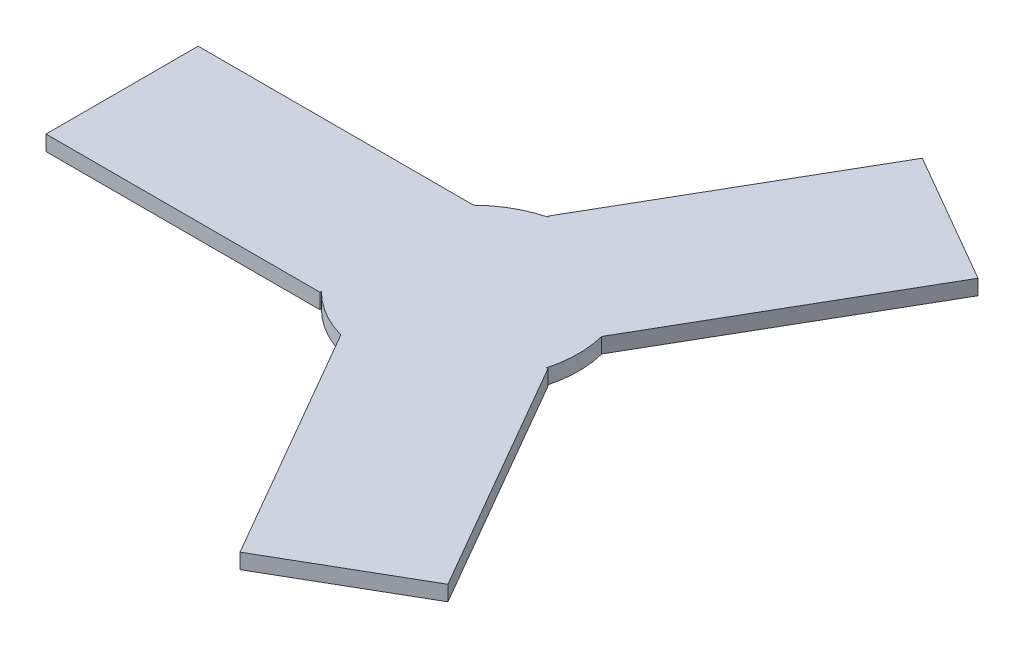
ISO-10303-21;
HEADER;
FILE_DESCRIPTION(('STEP AP214'),'2;1');
FILE_NAME('part.step','',(''),(''),'','','');
FILE_SCHEMA(('AUTOMOTIVE_DESIGN { 1 0 10303 214 1 1 1 1 }'));
ENDSEC;
DATA;
#1=APPLICATION_CONTEXT('core data for automotive mechanical design processes');
#2=APPLICATION_PROTOCOL_DEFINITION('international standard','automotive_design',2000,#1);
#3=PRODUCT_CONTEXT('',#1,'mechanical');
#4=PRODUCT('Part','Part','',(#3));
#5=PRODUCT_RELATED_PRODUCT_CATEGORY('part','',(#4));
#6=PRODUCT_DEFINITION_FORMATION('','',#4);
#7=PRODUCT_DEFINITION_CONTEXT('part definition',#1,'design');
#8=PRODUCT_DEFINITION('design','',#6,#7);
#9=PRODUCT_DEFINITION_SHAPE('','',#8);
#10=(LENGTH_UNIT() NAMED_UNIT(*) SI_UNIT(.MILLI.,.METRE.));
#11=(NAMED_UNIT(*) PLANE_ANGLE_UNIT() SI_UNIT($,.RADIAN.));
#12=(NAMED_UNIT(*) SI_UNIT($,.STERADIAN.) SOLID_ANGLE_UNIT());
#13=UNCERTAINTY_MEASURE_WITH_UNIT(LENGTH_MEASURE(1.E-05),#10,'distance_accuracy_value','');
#14=(GEOMETRIC_REPRESENTATION_CONTEXT(3) GLOBAL_UNCERTAINTY_ASSIGNED_CONTEXT((#13)) GLOBAL_UNIT_ASSIGNED_CONTEXT((#10,
#11,#12)) REPRESENTATION_CONTEXT('',''));
#15=CARTESIAN_POINT('',(0.,0.,0.));
#16=DIRECTION('',(0.,0.,1.));
#17=DIRECTION('',(1.,0.,0.));
#18=AXIS2_PLACEMENT_3D('',#15,#16,#17);
#19=CARTESIAN_POINT('',(0.,5.,-24.9999999999607));
#20=DIRECTION('',(0.,0.,-1.));
#21=DIRECTION('',(-1.,0.,0.));
#22=AXIS2_PLACEMENT_3D('',#19,#20,#21);
#23=PLANE('',#22);
#24=DIRECTION('',(1.,0.,0.));
#25=VECTOR('',#24,1.);
#26=CARTESIAN_POINT('',(0.,0.,-24.9999999999607));
#27=LINE('',#26,#25);
#28=CARTESIAN_POINT('',(-115.,0.,-24.9999999999607));
#29=VERTEX_POINT('',#28);
#30=CARTESIAN_POINT('',(-24.4948974278719,0.,-24.9999999999607));
#31=VERTEX_POINT('',#30);
#32=EDGE_CURVE('E314',#29,#31,#27,.T.);
#33=ORIENTED_EDGE('',*,*,#32,.F.);
#34=DIRECTION('',(0.,-1.,0.));
#35=VECTOR('',#34,1.);
#36=CARTESIAN_POINT('',(-115.,5.,-24.9999999999607));
#37=LINE('',#36,#35);
#38=CARTESIAN_POINT('',(-115.,5.,-24.9999999999607));
#39=VERTEX_POINT('',#38);
#40=EDGE_CURVE('E199',#39,#29,#37,.T.);
#41=ORIENTED_EDGE('',*,*,#40,.F.);
#42=DIRECTION('',(1.,0.,0.));
#43=VECTOR('',#42,1.);
#44=CARTESIAN_POINT('',(0.,5.,-24.9999999999607));
#45=LINE('',#44,#43);
#46=CARTESIAN_POINT('',(-24.4948974278719,5.,-24.9999999999607));
#47=VERTEX_POINT('',#46);
#48=EDGE_CURVE('E583',#39,#47,#45,.T.);
#49=ORIENTED_EDGE('',*,*,#48,.T.);
#50=DIRECTION('',(0.,-1.,0.));
#51=VECTOR('',#50,1.);
#52=CARTESIAN_POINT('',(-24.4948974278719,5.,-24.9999999999607));
#53=LINE('',#52,#51);
#54=EDGE_CURVE('E12',#47,#31,#53,.T.);
#55=ORIENTED_EDGE('',*,*,#54,.T.);
#56=EDGE_LOOP('',(#33,#41,#49,#55));
#57=FACE_BOUND('',#56,.T.);
#58=ADVANCED_FACE('F189',(#57),#23,.T.);
#59=CARTESIAN_POINT('',(-115.,5.,0.));
#60=DIRECTION('',(-1.,0.,0.));
#61=DIRECTION('',(0.,0.,1.));
#62=AXIS2_PLACEMENT_3D('',#59,#60,#61);
#63=PLANE('',#62);
#64=DIRECTION('',(0.,0.,-1.));
#65=VECTOR('',#64,1.);
#66=CARTESIAN_POINT('',(-115.,0.,0.));
#67=LINE('',#66,#65);
#68=CARTESIAN_POINT('',(-115.,0.,25.000000000055));
#69=VERTEX_POINT('',#68);
#70=EDGE_CURVE('E580',#69,#29,#67,.T.);
#71=ORIENTED_EDGE('',*,*,#70,.F.);
#72=DIRECTION('',(0.,-1.,0.));
#73=VECTOR('',#72,1.);
#74=CARTESIAN_POINT('',(-115.,5.,25.000000000055));
#75=LINE('',#74,#73);
#76=CARTESIAN_POINT('',(-115.,5.,25.000000000055));
#77=VERTEX_POINT('',#76);
#78=EDGE_CURVE('E577',#77,#69,#75,.T.);
#79=ORIENTED_EDGE('',*,*,#78,.F.);
#80=DIRECTION('',(0.,0.,-1.));
#81=VECTOR('',#80,1.);
#82=CARTESIAN_POINT('',(-115.,5.,0.));
#83=LINE('',#82,#81);
#84=EDGE_CURVE('E585',#77,#39,#83,.T.);
#85=ORIENTED_EDGE('',*,*,#84,.T.);
#86=ORIENTED_EDGE('',*,*,#40,.T.);
#87=EDGE_LOOP('',(#71,#79,#85,#86));
#88=FACE_BOUND('',#87,.T.);
#89=ADVANCED_FACE('F429',(#88),#63,.T.);
#90=CARTESIAN_POINT('',(0.,5.,25.000000000055));
#91=DIRECTION('',(0.,0.,1.));
#92=DIRECTION('',(1.,0.,0.));
#93=AXIS2_PLACEMENT_3D('',#90,#91,#92);
#94=PLANE('',#93);
#95=DIRECTION('',(-1.,0.,0.));
#96=VECTOR('',#95,1.);
#97=CARTESIAN_POINT('',(0.,0.,25.000000000055));
#98=LINE('',#97,#96);
#99=CARTESIAN_POINT('',(-25.,0.,25.000000000055));
#100=VERTEX_POINT('',#99);
#101=EDGE_CURVE('E572',#100,#69,#98,.T.);
#102=ORIENTED_EDGE('',*,*,#101,.F.);
#103=DIRECTION('',(0.,-1.,0.));
#104=VECTOR('',#103,1.);
#105=CARTESIAN_POINT('',(-25.,5.,25.000000000055));
#106=LINE('',#105,#104);
#107=CARTESIAN_POINT('',(-25.,5.,25.000000000055));
#108=VERTEX_POINT('',#107);
#109=EDGE_CURVE('E575',#108,#100,#106,.T.);
#110=ORIENTED_EDGE('',*,*,#109,.F.);
#111=DIRECTION('',(-1.,0.,0.));
#112=VECTOR('',#111,1.);
#113=CARTESIAN_POINT('',(0.,5.,25.000000000055));
#114=LINE('',#113,#112);
#115=EDGE_CURVE('E598',#108,#77,#114,.T.);
#116=ORIENTED_EDGE('',*,*,#115,.T.);
#117=ORIENTED_EDGE('',*,*,#78,.T.);
#118=EDGE_LOOP('',(#102,#110,#116,#117));
#119=FACE_BOUND('',#118,.T.);
#120=ADVANCED_FACE('F435',(#119),#94,.T.);
#121=CARTESIAN_POINT('',(-24.744923458781,5.,-0.249974489722791));
#122=DIRECTION('',(0.99994897818343,0.,0.0101015360175433));
#123=DIRECTION('',(0.0101015360175433,0.,-0.99994897818343));
#124=AXIS2_PLACEMENT_3D('',#121,#122,#123);
#125=PLANE('',#124);
#126=DIRECTION('',(-0.0101015360175433,0.,0.99994897818343));
#127=VECTOR('',#126,1.);
#128=CARTESIAN_POINT('',(-24.744923458781,0.,-0.249974489722791));
#129=LINE('',#128,#127);
#130=CARTESIAN_POINT('',(-24.9949494896901,0.,24.5000510205151));
#131=VERTEX_POINT('',#130);
#132=EDGE_CURVE('E579',#131,#100,#129,.T.);
#133=ORIENTED_EDGE('',*,*,#132,.F.);
#134=DIRECTION('',(0.,-1.,0.));
#135=VECTOR('',#134,1.);
#136=CARTESIAN_POINT('',(-24.9949494896901,5.,24.5000510205151));
#137=LINE('',#136,#135);
#138=CARTESIAN_POINT('',(-24.9949494896901,5.,24.5000510205151));
#139=VERTEX_POINT('',#138);
#140=EDGE_CURVE('E208',#139,#131,#137,.T.);
#141=ORIENTED_EDGE('',*,*,#140,.F.);
#142=DIRECTION('',(-0.0101015360175433,0.,0.99994897818343));
#143=VECTOR('',#142,1.);
#144=CARTESIAN_POINT('',(-24.744923458781,5.,-0.249974489722791));
#145=LINE('',#144,#143);
#146=EDGE_CURVE('E391',#139,#108,#145,.T.);
#147=ORIENTED_EDGE('',*,*,#146,.T.);
#148=ORIENTED_EDGE('',*,*,#109,.T.);
#149=EDGE_LOOP('',(#133,#141,#147,#148));
#150=FACE_BOUND('',#149,.T.);
#151=ADVANCED_FACE('F444',(#150),#125,.T.);
#152=CARTESIAN_POINT('',(0.,0.,0.));
#153=DIRECTION('',(0.,1.,0.));
#154=DIRECTION('',(0.,0.,1.));
#155=AXIS2_PLACEMENT_3D('',#152,#153,#154);
#156=PLANE('',#155);
#157=ORIENTED_EDGE('',*,*,#32,.T.);
#158=CARTESIAN_POINT('',(0.,0.,0.));
#159=DIRECTION('',(0.,1.,0.));
#160=DIRECTION('',(0.,0.,1.));
#161=AXIS2_PLACEMENT_3D('',#158,#159,#160);
#162=CIRCLE('',#161,35.);
#163=CARTESIAN_POINT('',(-8.72019183293593,0.,-33.896286734638));
#164=VERTEX_POINT('',#163);
#165=EDGE_CURVE('E297',#164,#31,#162,.T.);
#166=ORIENTED_EDGE('',*,*,#165,.F.);
#167=DIRECTION('',(0.86093044958637,0.,0.508722675900151));
#168=VECTOR('',#167,1.);
#169=CARTESIAN_POINT('',(12.5889459877885,0.,-21.3047450851444));
#170=LINE('',#169,#168);
#171=CARTESIAN_POINT('',(-9.15063509465858,0.,-34.1506350946385));
#172=VERTEX_POINT('',#171);
#173=EDGE_CURVE('E304',#172,#164,#170,.T.);
#174=ORIENTED_EDGE('',*,*,#173,.F.);
#175=DIRECTION('',(0.5,0.,-0.866025403784439));
#176=VECTOR('',#175,1.);
#177=CARTESIAN_POINT('',(-21.6506350946586,0.,-12.5000000000275));
#178=LINE('',#177,#176);
#179=CARTESIAN_POINT('',(35.8493649053414,0.,-112.092921435238));
#180=VERTEX_POINT('',#179);
#181=EDGE_CURVE('E309',#172,#180,#178,.T.);
#182=ORIENTED_EDGE('',*,*,#181,.T.);
#183=DIRECTION('',(0.866025403784439,0.,0.5));
#184=VECTOR('',#183,1.);
#185=CARTESIAN_POINT('',(57.5,0.,-99.5929214352105));
#186=LINE('',#185,#184);
#187=CARTESIAN_POINT('',(79.1506350945769,0.,-87.0929214352301));
#188=VERTEX_POINT('',#187);
#189=EDGE_CURVE('E328',#180,#188,#186,.T.);
#190=ORIENTED_EDGE('',*,*,#189,.T.);
#191=DIRECTION('',(0.5,0.,-0.866025403784439));
#192=VECTOR('',#191,1.);
#193=CARTESIAN_POINT('',(21.6506350945769,0.,12.4999999999803));
#194=LINE('',#193,#192);
#195=CARTESIAN_POINT('',(33.8980838085129,0.,-8.71320343565085));
#196=VERTEX_POINT('',#195);
#197=EDGE_CURVE('E323',#196,#188,#194,.T.);
#198=ORIENTED_EDGE('',*,*,#197,.F.);
#199=CARTESIAN_POINT('',(33.715141322626,0.,9.39623571412291));
#200=VERTEX_POINT('',#199);
#201=EDGE_CURVE('E317',#200,#196,#162,.T.);
#202=ORIENTED_EDGE('',*,*,#201,.F.);
#203=DIRECTION('',(0.871031985603914,0.,-0.49122630228328));
#204=VECTOR('',#203,1.);
#205=CARTESIAN_POINT('',(12.1559774709925,0.,21.5547195748672));
#206=LINE('',#205,#204);
#207=CARTESIAN_POINT('',(34.1506350946586,0.,9.15063509458348));
#208=VERTEX_POINT('',#207);
#209=EDGE_CURVE('E358',#200,#208,#206,.T.);
#210=ORIENTED_EDGE('',*,*,#209,.T.);
#211=DIRECTION('',(0.500000000000001,0.,0.866025403784438));
#212=VECTOR('',#211,1.);
#213=CARTESIAN_POINT('',(21.6506350946586,0.,-12.5000000000275));
#214=LINE('',#213,#212);
#215=CARTESIAN_POINT('',(79.1506350946587,0.,87.0929214351829));
#216=VERTEX_POINT('',#215);
#217=EDGE_CURVE('E350',#208,#216,#214,.T.);
#218=ORIENTED_EDGE('',*,*,#217,.T.);
#219=DIRECTION('',(-0.866025403784438,0.,0.5));
#220=VECTOR('',#219,1.);
#221=CARTESIAN_POINT('',(57.5000000000001,0.,99.5929214352104));
#222=LINE('',#221,#220);
#223=CARTESIAN_POINT('',(35.8493649054231,0.,112.092921435191));
#224=VERTEX_POINT('',#223);
#225=EDGE_CURVE('E344',#216,#224,#222,.T.);
#226=ORIENTED_EDGE('',*,*,#225,.T.);
#227=DIRECTION('',(0.5,0.,0.866025403784438));
#228=VECTOR('',#227,1.);
#229=CARTESIAN_POINT('',(-21.6506350945769,0.,12.4999999999803));
#230=LINE('',#229,#228);
#231=CARTESIAN_POINT('',(-9.40318638064095,0.,33.7132034356115));
#232=VERTEX_POINT('',#231);
#233=EDGE_CURVE('E341',#232,#224,#230,.T.);
#234=ORIENTED_EDGE('',*,*,#233,.F.);
#235=EDGE_CURVE('E315',#131,#232,#162,.T.);
#236=ORIENTED_EDGE('',*,*,#235,.F.);
#237=ORIENTED_EDGE('',*,*,#132,.T.);
#238=ORIENTED_EDGE('',*,*,#101,.T.);
#239=ORIENTED_EDGE('',*,*,#70,.T.);
#240=EDGE_LOOP('',(#157,#166,#174,#182,#190,#198,#202,#210,#218,#226,#234,#236,#237,#238,#239));
#241=FACE_BOUND('',#240,.T.);
#242=ADVANCED_FACE('F311',(#241),#156,.F.);
#243=CARTESIAN_POINT('',(0.,5.,0.));
#244=DIRECTION('',(0.,1.,0.));
#245=DIRECTION('',(0.,0.,1.));
#246=AXIS2_PLACEMENT_3D('',#243,#244,#245);
#247=PLANE('',#246);
#248=ORIENTED_EDGE('',*,*,#146,.F.);
#249=CARTESIAN_POINT('',(0.,5.,0.));
#250=DIRECTION('',(0.,1.,0.));
#251=DIRECTION('',(0.,0.,1.));
#252=AXIS2_PLACEMENT_3D('',#249,#250,#251);
#253=CIRCLE('',#252,35.);
#254=CARTESIAN_POINT('',(-9.40318638064095,5.,33.7132034356115));
#255=VERTEX_POINT('',#254);
#256=EDGE_CURVE('E302',#139,#255,#253,.T.);
#257=ORIENTED_EDGE('',*,*,#256,.T.);
#258=DIRECTION('',(0.5,0.,0.866025403784438));
#259=VECTOR('',#258,1.);
#260=CARTESIAN_POINT('',(-21.6506350945769,5.,12.4999999999803));
#261=LINE('',#260,#259);
#262=CARTESIAN_POINT('',(35.8493649054231,5.,112.092921435191));
#263=VERTEX_POINT('',#262);
#264=EDGE_CURVE('E361',#255,#263,#261,.T.);
#265=ORIENTED_EDGE('',*,*,#264,.T.);
#266=DIRECTION('',(-0.866025403784438,0.,0.5));
#267=VECTOR('',#266,1.);
#268=CARTESIAN_POINT('',(57.5000000000001,5.,99.5929214352104));
#269=LINE('',#268,#267);
#270=CARTESIAN_POINT('',(79.1506350946587,5.,87.0929214351829));
#271=VERTEX_POINT('',#270);
#272=EDGE_CURVE('E395',#271,#263,#269,.T.);
#273=ORIENTED_EDGE('',*,*,#272,.F.);
#274=DIRECTION('',(0.500000000000001,0.,0.866025403784438));
#275=VECTOR('',#274,1.);
#276=CARTESIAN_POINT('',(21.6506350946586,5.,-12.5000000000275));
#277=LINE('',#276,#275);
#278=CARTESIAN_POINT('',(34.1506350946586,5.,9.15063509458348));
#279=VERTEX_POINT('',#278);
#280=EDGE_CURVE('E397',#279,#271,#277,.T.);
#281=ORIENTED_EDGE('',*,*,#280,.F.);
#282=DIRECTION('',(0.871031985603914,0.,-0.49122630228328));
#283=VECTOR('',#282,1.);
#284=CARTESIAN_POINT('',(12.1559774709925,5.,21.5547195748672));
#285=LINE('',#284,#283);
#286=CARTESIAN_POINT('',(33.715141322626,5.,9.39623571412291));
#287=VERTEX_POINT('',#286);
#288=EDGE_CURVE('E353',#287,#279,#285,.T.);
#289=ORIENTED_EDGE('',*,*,#288,.F.);
#290=CARTESIAN_POINT('',(33.8980838085129,5.,-8.71320343565085));
#291=VERTEX_POINT('',#290);
#292=EDGE_CURVE('E319',#287,#291,#253,.T.);
#293=ORIENTED_EDGE('',*,*,#292,.T.);
#294=DIRECTION('',(0.5,0.,-0.866025403784439));
#295=VECTOR('',#294,1.);
#296=CARTESIAN_POINT('',(21.6506350945769,5.,12.4999999999803));
#297=LINE('',#296,#295);
#298=CARTESIAN_POINT('',(79.1506350945769,5.,-87.0929214352301));
#299=VERTEX_POINT('',#298);
#300=EDGE_CURVE('E374',#291,#299,#297,.T.);
#301=ORIENTED_EDGE('',*,*,#300,.T.);
#302=DIRECTION('',(0.866025403784439,0.,0.5));
#303=VECTOR('',#302,1.);
#304=CARTESIAN_POINT('',(57.5,5.,-99.5929214352105));
#305=LINE('',#304,#303);
#306=CARTESIAN_POINT('',(35.8493649053414,5.,-112.092921435238));
#307=VERTEX_POINT('',#306);
#308=EDGE_CURVE('E376',#307,#299,#305,.T.);
#309=ORIENTED_EDGE('',*,*,#308,.F.);
#310=DIRECTION('',(0.5,0.,-0.866025403784439));
#311=VECTOR('',#310,1.);
#312=CARTESIAN_POINT('',(-21.6506350946586,5.,-12.5000000000275));
#313=LINE('',#312,#311);
#314=CARTESIAN_POINT('',(-9.15063509465858,5.,-34.1506350946385));
#315=VERTEX_POINT('',#314);
#316=EDGE_CURVE('E378',#315,#307,#313,.T.);
#317=ORIENTED_EDGE('',*,*,#316,.F.);
#318=DIRECTION('',(0.86093044958637,0.,0.508722675900151));
#319=VECTOR('',#318,1.);
#320=CARTESIAN_POINT('',(12.5889459877885,5.,-21.3047450851444));
#321=LINE('',#320,#319);
#322=CARTESIAN_POINT('',(-8.72019183293593,5.,-33.896286734638));
#323=VERTEX_POINT('',#322);
#324=EDGE_CURVE('E380',#315,#323,#321,.T.);
#325=ORIENTED_EDGE('',*,*,#324,.T.);
#326=EDGE_CURVE('E300',#323,#47,#253,.T.);
#327=ORIENTED_EDGE('',*,*,#326,.T.);
#328=ORIENTED_EDGE('',*,*,#48,.F.);
#329=ORIENTED_EDGE('',*,*,#84,.F.);
#330=ORIENTED_EDGE('',*,*,#115,.F.);
#331=EDGE_LOOP('',(#248,#257,#265,#273,#281,#289,#293,#301,#309,#317,#325,#327,#328,#329,#330));
#332=FACE_BOUND('',#331,.T.);
#333=ADVANCED_FACE('F388',(#332),#247,.T.);
#334=CARTESIAN_POINT('',(21.6506350946586,5.,-12.5000000000275));
#335=DIRECTION('',(0.866025403784438,0.,-0.500000000000001));
#336=DIRECTION('',(-0.500000000000001,0.,-0.866025403784438));
#337=AXIS2_PLACEMENT_3D('',#334,#335,#336);
#338=PLANE('',#337);
#339=ORIENTED_EDGE('',*,*,#217,.F.);
#340=DIRECTION('',(0.,-1.,0.));
#341=VECTOR('',#340,1.);
#342=CARTESIAN_POINT('',(34.1506350946586,5.,9.15063509458348));
#343=LINE('',#342,#341);
#344=EDGE_CURVE('E364',#279,#208,#343,.T.);
#345=ORIENTED_EDGE('',*,*,#344,.F.);
#346=ORIENTED_EDGE('',*,*,#280,.T.);
#347=DIRECTION('',(0.,-1.,0.));
#348=VECTOR('',#347,1.);
#349=CARTESIAN_POINT('',(79.1506350946587,5.,87.0929214351829));
#350=LINE('',#349,#348);
#351=EDGE_CURVE('E366',#271,#216,#350,.T.);
#352=ORIENTED_EDGE('',*,*,#351,.T.);
#353=EDGE_LOOP('',(#339,#345,#346,#352));
#354=FACE_BOUND('',#353,.T.);
#355=ADVANCED_FACE('F413',(#354),#338,.T.);
#356=CARTESIAN_POINT('',(12.1559774709925,5.,21.5547195748672));
#357=DIRECTION('',(-0.49122630228328,0.,-0.871031985603913));
#358=DIRECTION('',(-0.871031985603913,0.,0.49122630228328));
#359=AXIS2_PLACEMENT_3D('',#356,#357,#358);
#360=PLANE('',#359);
#361=ORIENTED_EDGE('',*,*,#209,.F.);
#362=DIRECTION('',(0.,-1.,0.));
#363=VECTOR('',#362,1.);
#364=CARTESIAN_POINT('',(33.715141322626,5.,9.39623571412291));
#365=LINE('',#364,#363);
#366=EDGE_CURVE('E362',#287,#200,#365,.T.);
#367=ORIENTED_EDGE('',*,*,#366,.F.);
#368=ORIENTED_EDGE('',*,*,#288,.T.);
#369=ORIENTED_EDGE('',*,*,#344,.T.);
#370=EDGE_LOOP('',(#361,#367,#368,#369));
#371=FACE_BOUND('',#370,.T.);
#372=ADVANCED_FACE('F407',(#371),#360,.T.);
#373=CARTESIAN_POINT('',(21.6506350945769,5.,12.4999999999803));
#374=DIRECTION('',(-0.866025403784439,0.,-0.5));
#375=DIRECTION('',(-0.5,0.,0.866025403784439));
#376=AXIS2_PLACEMENT_3D('',#373,#374,#375);
#377=PLANE('',#376);
#378=ORIENTED_EDGE('',*,*,#197,.T.);
#379=DIRECTION('',(0.,-1.,0.));
#380=VECTOR('',#379,1.);
#381=CARTESIAN_POINT('',(79.1506350945769,5.,-87.0929214352301));
#382=LINE('',#381,#380);
#383=EDGE_CURVE('E337',#299,#188,#382,.T.);
#384=ORIENTED_EDGE('',*,*,#383,.F.);
#385=ORIENTED_EDGE('',*,*,#300,.F.);
#386=DIRECTION('',(0.,-1.,0.));
#387=VECTOR('',#386,1.);
#388=CARTESIAN_POINT('',(33.8980838085129,5.,-8.71320343565085));
#389=LINE('',#388,#387);
#390=EDGE_CURVE('E193',#291,#196,#389,.T.);
#391=ORIENTED_EDGE('',*,*,#390,.T.);
#392=EDGE_LOOP('',(#378,#384,#385,#391));
#393=FACE_BOUND('',#392,.T.);
#394=ADVANCED_FACE('F191',(#393),#377,.F.);
#395=CARTESIAN_POINT('',(57.5,5.,-99.5929214352105));
#396=DIRECTION('',(0.5,0.,-0.866025403784439));
#397=DIRECTION('',(-0.866025403784439,0.,-0.5));
#398=AXIS2_PLACEMENT_3D('',#395,#396,#397);
#399=PLANE('',#398);
#400=ORIENTED_EDGE('',*,*,#189,.F.);
#401=DIRECTION('',(0.,-1.,0.));
#402=VECTOR('',#401,1.);
#403=CARTESIAN_POINT('',(35.8493649053414,5.,-112.092921435238));
#404=LINE('',#403,#402);
#405=EDGE_CURVE('E336',#307,#180,#404,.T.);
#406=ORIENTED_EDGE('',*,*,#405,.F.);
#407=ORIENTED_EDGE('',*,*,#308,.T.);
#408=ORIENTED_EDGE('',*,*,#383,.T.);
#409=EDGE_LOOP('',(#400,#406,#407,#408));
#410=FACE_BOUND('',#409,.T.);
#411=ADVANCED_FACE('F414',(#410),#399,.T.);
#412=CARTESIAN_POINT('',(-21.6506350946586,5.,-12.5000000000275));
#413=DIRECTION('',(-0.866025403784439,0.,-0.5));
#414=DIRECTION('',(-0.5,0.,0.866025403784439));
#415=AXIS2_PLACEMENT_3D('',#412,#413,#414);
#416=PLANE('',#415);
#417=ORIENTED_EDGE('',*,*,#181,.F.);
#418=DIRECTION('',(0.,-1.,0.));
#419=VECTOR('',#418,1.);
#420=CARTESIAN_POINT('',(-9.15063509465858,5.,-34.1506350946385));
#421=LINE('',#420,#419);
#422=EDGE_CURVE('E287',#315,#172,#421,.T.);
#423=ORIENTED_EDGE('',*,*,#422,.F.);
#424=ORIENTED_EDGE('',*,*,#316,.T.);
#425=ORIENTED_EDGE('',*,*,#405,.T.);
#426=EDGE_LOOP('',(#417,#423,#424,#425));
#427=FACE_BOUND('',#426,.T.);
#428=ADVANCED_FACE('F417',(#427),#416,.T.);
#429=CARTESIAN_POINT('',(57.5000000000001,5.,99.5929214352104));
#430=DIRECTION('',(0.5,0.,0.866025403784438));
#431=DIRECTION('',(0.866025403784438,0.,-0.5));
#432=AXIS2_PLACEMENT_3D('',#429,#430,#431);
#433=PLANE('',#432);
#434=ORIENTED_EDGE('',*,*,#225,.F.);
#435=ORIENTED_EDGE('',*,*,#351,.F.);
#436=ORIENTED_EDGE('',*,*,#272,.T.);
#437=DIRECTION('',(0.,-1.,0.));
#438=VECTOR('',#437,1.);
#439=CARTESIAN_POINT('',(35.8493649054231,5.,112.092921435191));
#440=LINE('',#439,#438);
#441=EDGE_CURVE('E368',#263,#224,#440,.T.);
#442=ORIENTED_EDGE('',*,*,#441,.T.);
#443=EDGE_LOOP('',(#434,#435,#436,#442));
#444=FACE_BOUND('',#443,.T.);
#445=ADVANCED_FACE('F412',(#444),#433,.T.);
#446=CARTESIAN_POINT('',(0.,5.,0.));
#447=DIRECTION('',(0.,-1.,0.));
#448=DIRECTION('',(0.,0.,-1.));
#449=AXIS2_PLACEMENT_3D('',#446,#447,#448);
#450=CYLINDRICAL_SURFACE('',#449,35.);
#451=ORIENTED_EDGE('',*,*,#201,.T.);
#452=ORIENTED_EDGE('',*,*,#390,.F.);
#453=ORIENTED_EDGE('',*,*,#292,.F.);
#454=ORIENTED_EDGE('',*,*,#366,.T.);
#455=EDGE_LOOP('',(#451,#452,#453,#454));
#456=FACE_BOUND('',#455,.T.);
#457=ADVANCED_FACE('F424',(#456),#450,.T.);
#458=CARTESIAN_POINT('',(12.5889459877885,5.,-21.3047450851444));
#459=DIRECTION('',(0.508722675900151,0.,-0.86093044958637));
#460=DIRECTION('',(-0.86093044958637,0.,-0.508722675900151));
#461=AXIS2_PLACEMENT_3D('',#458,#459,#460);
#462=PLANE('',#461);
#463=ORIENTED_EDGE('',*,*,#173,.T.);
#464=DIRECTION('',(0.,-1.,0.));
#465=VECTOR('',#464,1.);
#466=CARTESIAN_POINT('',(-8.72019183293593,5.,-33.896286734638));
#467=LINE('',#466,#465);
#468=EDGE_CURVE('E293',#323,#164,#467,.T.);
#469=ORIENTED_EDGE('',*,*,#468,.F.);
#470=ORIENTED_EDGE('',*,*,#324,.F.);
#471=ORIENTED_EDGE('',*,*,#422,.T.);
#472=EDGE_LOOP('',(#463,#469,#470,#471));
#473=FACE_BOUND('',#472,.T.);
#474=ADVANCED_FACE('F305',(#473),#462,.F.);
#475=CARTESIAN_POINT('',(-21.6506350945769,5.,12.4999999999803));
#476=DIRECTION('',(0.866025403784438,0.,-0.5));
#477=DIRECTION('',(-0.5,0.,-0.866025403784438));
#478=AXIS2_PLACEMENT_3D('',#475,#476,#477);
#479=PLANE('',#478);
#480=ORIENTED_EDGE('',*,*,#233,.T.);
#481=ORIENTED_EDGE('',*,*,#441,.F.);
#482=ORIENTED_EDGE('',*,*,#264,.F.);
#483=DIRECTION('',(0.,-1.,0.));
#484=VECTOR('',#483,1.);
#485=CARTESIAN_POINT('',(-9.40318638064095,5.,33.7132034356115));
#486=LINE('',#485,#484);
#487=EDGE_CURVE('E370',#255,#232,#486,.T.);
#488=ORIENTED_EDGE('',*,*,#487,.T.);
#489=EDGE_LOOP('',(#480,#481,#482,#488));
#490=FACE_BOUND('',#489,.T.);
#491=ADVANCED_FACE('F393',(#490),#479,.F.);
#492=ORIENTED_EDGE('',*,*,#235,.T.);
#493=ORIENTED_EDGE('',*,*,#487,.F.);
#494=ORIENTED_EDGE('',*,*,#256,.F.);
#495=ORIENTED_EDGE('',*,*,#140,.T.);
#496=EDGE_LOOP('',(#492,#493,#494,#495));
#497=FACE_BOUND('',#496,.T.);
#498=ADVANCED_FACE('F451',(#497),#450,.T.);
#499=ORIENTED_EDGE('',*,*,#165,.T.);
#500=ORIENTED_EDGE('',*,*,#54,.F.);
#501=ORIENTED_EDGE('',*,*,#326,.F.);
#502=ORIENTED_EDGE('',*,*,#468,.T.);
#503=EDGE_LOOP('',(#499,#500,#501,#502));
#504=FACE_BOUND('',#503,.T.);
#505=ADVANCED_FACE('F294',(#504),#450,.T.);
#506=CLOSED_SHELL('',(#58,#89,#120,#151,#242,#333,#355,#372,#394,#411,#428,#445,#457,#474,#491,
#498,#505));
#507=MANIFOLD_SOLID_BREP('B2',#506);
#508=ADVANCED_BREP_SHAPE_REPRESENTATION('',(#18,#507),#14);
#509=SHAPE_DEFINITION_REPRESENTATION(#9,#508);
ENDSEC;
END-ISO-10303-21;
